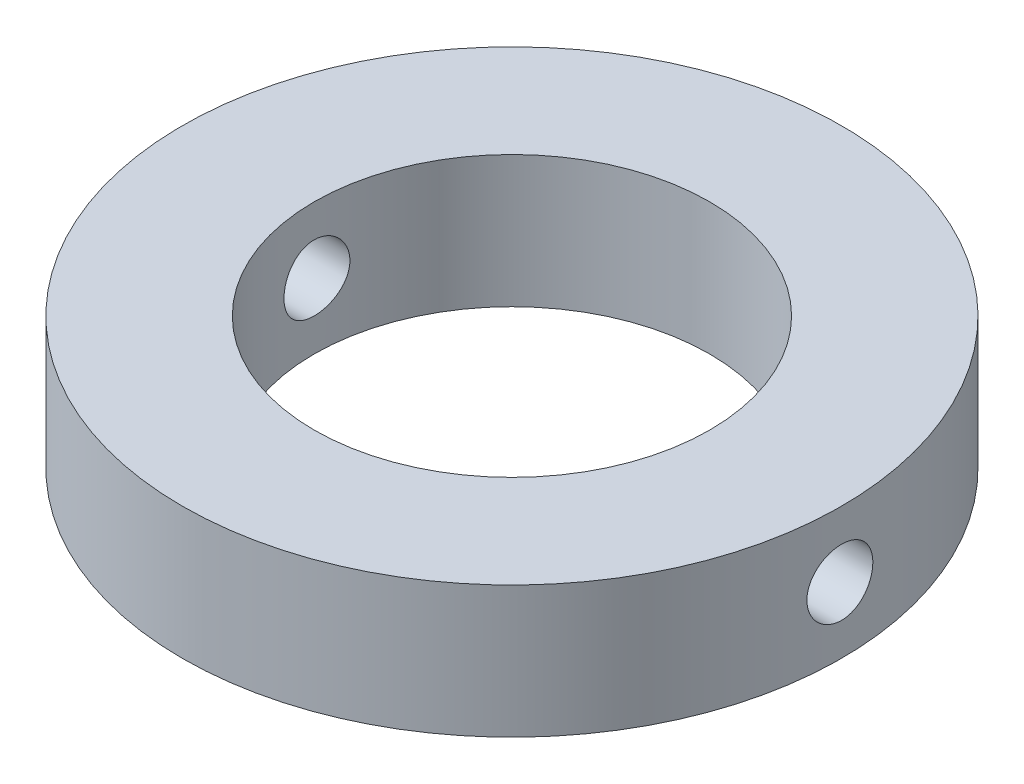
ISO-10303-21;
HEADER;
FILE_DESCRIPTION(('STEP AP214'),'2;1');
FILE_NAME('part.step','',(''),(''),'','','');
FILE_SCHEMA(('AUTOMOTIVE_DESIGN { 1 0 10303 214 1 1 1 1 }'));
ENDSEC;
DATA;
#1=APPLICATION_CONTEXT('core data for automotive mechanical design processes');
#2=APPLICATION_PROTOCOL_DEFINITION('international standard','automotive_design',2000,#1);
#3=PRODUCT_CONTEXT('',#1,'mechanical');
#4=PRODUCT('Part','Part','',(#3));
#5=PRODUCT_RELATED_PRODUCT_CATEGORY('part','',(#4));
#6=PRODUCT_DEFINITION_FORMATION('','',#4);
#7=PRODUCT_DEFINITION_CONTEXT('part definition',#1,'design');
#8=PRODUCT_DEFINITION('design','',#6,#7);
#9=PRODUCT_DEFINITION_SHAPE('','',#8);
#10=(LENGTH_UNIT() NAMED_UNIT(*) SI_UNIT(.MILLI.,.METRE.));
#11=(NAMED_UNIT(*) PLANE_ANGLE_UNIT() SI_UNIT($,.RADIAN.));
#12=(NAMED_UNIT(*) SI_UNIT($,.STERADIAN.) SOLID_ANGLE_UNIT());
#13=UNCERTAINTY_MEASURE_WITH_UNIT(LENGTH_MEASURE(1.E-05),#10,'distance_accuracy_value','');
#14=(GEOMETRIC_REPRESENTATION_CONTEXT(3) GLOBAL_UNCERTAINTY_ASSIGNED_CONTEXT((#13)) GLOBAL_UNIT_ASSIGNED_CONTEXT((#10,
#11,#12)) REPRESENTATION_CONTEXT('',''));
#15=CARTESIAN_POINT('',(0.,0.,0.));
#16=DIRECTION('',(0.,0.,1.));
#17=DIRECTION('',(1.,0.,0.));
#18=AXIS2_PLACEMENT_3D('',#15,#16,#17);
#19=CARTESIAN_POINT('',(0.,10.,0.));
#20=DIRECTION('',(0.,1.,0.));
#21=DIRECTION('',(0.,0.,1.));
#22=AXIS2_PLACEMENT_3D('',#19,#20,#21);
#23=PLANE('',#22);
#24=CARTESIAN_POINT('',(0.,10.,0.));
#25=DIRECTION('',(0.,1.,0.));
#26=DIRECTION('',(0.,0.,1.));
#27=AXIS2_PLACEMENT_3D('',#24,#25,#26);
#28=CIRCLE('',#27,25.);
#29=CARTESIAN_POINT('',(0.,10.,25.));
#30=VERTEX_POINT('',#29);
#31=EDGE_CURVE('E10',#30,#30,#28,.T.);
#32=ORIENTED_EDGE('',*,*,#31,.T.);
#33=EDGE_LOOP('',(#32));
#34=FACE_BOUND('',#33,.T.);
#35=CARTESIAN_POINT('',(0.,10.,0.));
#36=DIRECTION('',(0.,1.,0.));
#37=DIRECTION('',(0.,0.,1.));
#38=AXIS2_PLACEMENT_3D('',#35,#36,#37);
#39=CIRCLE('',#38,15.);
#40=CARTESIAN_POINT('',(0.,10.,15.));
#41=VERTEX_POINT('',#40);
#42=EDGE_CURVE('E56',#41,#41,#39,.T.);
#43=ORIENTED_EDGE('',*,*,#42,.F.);
#44=EDGE_LOOP('',(#43));
#45=FACE_BOUND('',#44,.T.);
#46=ADVANCED_FACE('F37',(#34,#45),#23,.T.);
#47=CARTESIAN_POINT('',(0.,0.,0.));
#48=DIRECTION('',(0.,1.,0.));
#49=DIRECTION('',(0.,0.,1.));
#50=AXIS2_PLACEMENT_3D('',#47,#48,#49);
#51=PLANE('',#50);
#52=CARTESIAN_POINT('',(0.,0.,0.));
#53=DIRECTION('',(0.,1.,0.));
#54=DIRECTION('',(0.,0.,1.));
#55=AXIS2_PLACEMENT_3D('',#52,#53,#54);
#56=CIRCLE('',#55,25.);
#57=CARTESIAN_POINT('',(0.,0.,25.));
#58=VERTEX_POINT('',#57);
#59=EDGE_CURVE('E51',#58,#58,#56,.T.);
#60=ORIENTED_EDGE('',*,*,#59,.F.);
#61=EDGE_LOOP('',(#60));
#62=FACE_BOUND('',#61,.T.);
#63=CARTESIAN_POINT('',(0.,0.,0.));
#64=DIRECTION('',(0.,1.,0.));
#65=DIRECTION('',(0.,0.,1.));
#66=AXIS2_PLACEMENT_3D('',#63,#64,#65);
#67=CIRCLE('',#66,15.);
#68=CARTESIAN_POINT('',(0.,0.,15.));
#69=VERTEX_POINT('',#68);
#70=EDGE_CURVE('E59',#69,#69,#67,.T.);
#71=ORIENTED_EDGE('',*,*,#70,.T.);
#72=EDGE_LOOP('',(#71));
#73=FACE_BOUND('',#72,.T.);
#74=ADVANCED_FACE('F95',(#62,#73),#51,.F.);
#75=CARTESIAN_POINT('',(0.,10.,0.));
#76=DIRECTION('',(0.,-1.,0.));
#77=DIRECTION('',(0.,0.,-1.));
#78=AXIS2_PLACEMENT_3D('',#75,#76,#77);
#79=CYLINDRICAL_SURFACE('',#78,25.);
#80=CARTESIAN_POINT('',(-24.8746859276655,5.,-2.5));
#81=CARTESIAN_POINT('',(-24.8746875699226,5.14004891043401,-2.49999393348378));
#82=CARTESIAN_POINT('',(-24.8758814248555,5.2801904210296,-2.48819214745619));
#83=CARTESIAN_POINT('',(-24.880527188953,5.55658796573384,-2.4412907869089));
#84=CARTESIAN_POINT('',(-24.8839815865305,5.69283954509373,-2.40616553721609));
#85=CARTESIAN_POINT('',(-24.8927533261847,5.95741454804476,-2.31365029017232));
#86=CARTESIAN_POINT('',(-24.8980695386697,6.0857427234786,-2.25627379073475));
#87=CARTESIAN_POINT('',(-24.9099645142955,6.33091948072937,-2.12091066847775));
#88=CARTESIAN_POINT('',(-24.9165430266082,6.4477703362093,-2.04292813906481));
#89=CARTESIAN_POINT('',(-24.9302481677475,6.66712815914375,-1.86826190499676));
#90=CARTESIAN_POINT('',(-24.9373765001317,6.76958752375946,-1.77151854527065));
#91=CARTESIAN_POINT('',(-24.951362630893,6.95684402250892,-1.56220428829891));
#92=CARTESIAN_POINT('',(-24.9582204168803,7.04164034851578,-1.44963266726642));
#93=CARTESIAN_POINT('',(-24.9709095788901,7.19132814251788,-1.21156590412747));
#94=CARTESIAN_POINT('',(-24.9767387723662,7.25617749698416,-1.08604415632392));
#95=CARTESIAN_POINT('',(-24.9866954218943,7.36386108287171,-0.825824960718776));
#96=CARTESIAN_POINT('',(-24.9908229194266,7.40669585092367,-0.691127736670547));
#97=CARTESIAN_POINT('',(-24.9968991642756,7.46899477338312,-0.416861956857374));
#98=CARTESIAN_POINT('',(-24.9988551960704,7.48853708187486,-0.277311317578953));
#99=CARTESIAN_POINT('',(-25.0003928899673,7.50393817283429,0.00310185172235791));
#100=CARTESIAN_POINT('',(-24.9999746136318,7.49979756936568,0.143964347636153));
#101=CARTESIAN_POINT('',(-24.9968167827796,7.46801381837461,0.422472110161401));
#102=CARTESIAN_POINT('',(-24.9940855287928,7.44045471109027,0.560127074837448));
#103=CARTESIAN_POINT('',(-24.9866182316233,7.36274717763345,0.828847948761333));
#104=CARTESIAN_POINT('',(-24.9818821623988,7.31259845803107,0.959913772394322));
#105=CARTESIAN_POINT('',(-24.9709234370979,7.1910430918639,1.21200078669897));
#106=CARTESIAN_POINT('',(-24.9646981841439,7.11959925617461,1.33300392745412));
#107=CARTESIAN_POINT('',(-24.9514596129852,6.95750869165908,1.56133378293548));
#108=CARTESIAN_POINT('',(-24.9444462716703,6.86686139963705,1.66866009640207));
#109=CARTESIAN_POINT('',(-24.9303823366963,6.66846442621588,1.86708192955672));
#110=CARTESIAN_POINT('',(-24.9233317143257,6.56064163814606,1.95810436547586));
#111=CARTESIAN_POINT('',(-24.9100184982056,6.33120783697306,2.12076883839479));
#112=CARTESIAN_POINT('',(-24.9037559055991,6.20959680386964,2.19241084728222));
#113=CARTESIAN_POINT('',(-24.8927272378537,5.95598243700052,2.31428046143308));
#114=CARTESIAN_POINT('',(-24.8879614783139,5.82397691894278,2.3645035514324));
#115=CARTESIAN_POINT('',(-24.8804725467734,5.55334848846328,2.44205183909397));
#116=CARTESIAN_POINT('',(-24.8777493125442,5.41472577778139,2.46937773435758));
#117=CARTESIAN_POINT('',(-24.8746645131854,5.13543955117623,2.5002619384799));
#118=CARTESIAN_POINT('',(-24.8742927886901,4.99478744933792,2.50392249161803));
#119=CARTESIAN_POINT('',(-24.8759262838693,4.71487183544284,2.48764061717841));
#120=CARTESIAN_POINT('',(-24.8779314714265,4.57560830464908,2.46769850852439));
#121=CARTESIAN_POINT('',(-24.88408361056,4.30272104430415,2.4048629362688));
#122=CARTESIAN_POINT('',(-24.8882260500336,4.16908607226335,2.36201781797227));
#123=CARTESIAN_POINT('',(-24.8981822759699,3.91089987067424,2.25464179918985));
#124=CARTESIAN_POINT('',(-24.9039961007167,3.78634884928204,2.19011040195897));
#125=CARTESIAN_POINT('',(-24.9166646088928,3.54940006492806,2.04093750355804));
#126=CARTESIAN_POINT('',(-24.9235227703668,3.43704514508436,1.95622824960173));
#127=CARTESIAN_POINT('',(-24.9374958156297,3.22811236681484,1.76920133362794));
#128=CARTESIAN_POINT('',(-24.9446107057716,3.13153489914981,1.66688323562034));
#129=CARTESIAN_POINT('',(-24.9583261962325,2.95654591650477,1.44709951056618));
#130=CARTESIAN_POINT('',(-24.9649248513869,2.87820110103445,1.32958063992363));
#131=CARTESIAN_POINT('',(-24.9768360526658,2.74236032873397,1.08299429354283));
#132=CARTESIAN_POINT('',(-24.9821486164123,2.68486408623224,0.953926976074064));
#133=CARTESIAN_POINT('',(-24.9908802603501,2.59246558086166,0.688140316082038));
#134=CARTESIAN_POINT('',(-24.9943027151412,2.55752303168697,0.551435094124898));
#135=CARTESIAN_POINT('',(-24.9988823653412,2.51109232605039,0.274062034959198));
#136=CARTESIAN_POINT('',(-25.0000396244141,2.4996035104149,0.133394309230544));
#137=CARTESIAN_POINT('',(-24.9999584578317,2.50041566609986,-0.147255560189367));
#138=CARTESIAN_POINT('',(-24.9987304594167,2.51261309209164,-0.28723801806132));
#139=CARTESIAN_POINT('',(-24.9940373394398,2.56023436414244,-0.563154720890907));
#140=CARTESIAN_POINT('',(-24.9905722161218,2.59565822843242,-0.699088962670915));
#141=CARTESIAN_POINT('',(-24.981793095349,2.68869814348233,-0.963049771919359));
#142=CARTESIAN_POINT('',(-24.9764793500812,2.74631116733539,-1.09107741519382));
#143=CARTESIAN_POINT('',(-24.9645953104074,2.88208292229245,-1.33566150038699));
#144=CARTESIAN_POINT('',(-24.9580250233539,2.9602415331778,-1.4522180094214));
#145=CARTESIAN_POINT('',(-24.9443296167264,3.13527404755938,-1.67108181106735));
#146=CARTESIAN_POINT('',(-24.9372022865175,3.232225040612,-1.77332731554835));
#147=CARTESIAN_POINT('',(-24.9232147692415,3.44193837886362,-1.96014439848286));
#148=CARTESIAN_POINT('',(-24.9163546466944,3.55470451292269,-2.04471172961962));
#149=CARTESIAN_POINT('',(-24.903659585265,3.79316085479978,-2.19394160106013));
#150=CARTESIAN_POINT('',(-24.8978272981327,3.91888320331014,-2.25855296998709));
#151=CARTESIAN_POINT('',(-24.8878798690615,4.17937072811559,-2.36566177024692));
#152=CARTESIAN_POINT('',(-24.883762791334,4.31412550981429,-2.40818414472465));
#153=CARTESIAN_POINT('',(-24.8787501884536,4.54136935224779,-2.45930422083382));
#154=CARTESIAN_POINT('',(-24.8772332983924,4.63240562826607,-2.47454428099556));
#155=CARTESIAN_POINT('',(-24.8752006294416,4.81561455760639,-2.49489414651278));
#156=CARTESIAN_POINT('',(-24.8746848463496,4.90778720615648,-2.50000399439316));
#157=CARTESIAN_POINT('',(-24.8746859276655,5.,-2.5));
#158=B_SPLINE_CURVE_WITH_KNOTS('',3,(#80,#81,#82,#83,#84,#85,#86,#87,#88,#89,#90,#91,#92,#93,
#94,#95,#96,#97,#98,#99,#100,#101,#102,#103,#104,#105,#106,#107,#108,#109,#110,#111,#112,#113,
#114,#115,#116,#117,#118,#119,#120,#121,#122,#123,#124,#125,#126,#127,#128,#129,#130,#131,#132,
#133,#134,#135,#136,#137,#138,#139,#140,#141,#142,#143,#144,#145,#146,#147,#148,#149,#150,#151,
#152,#153,#154,#155,#156,#157),.UNSPECIFIED.,.T.,.F.,(4,2,2,2,2,2,2,2,2,2,2,2,2,2,2,2,2,2,2,2,2,
2,2,2,2,2,2,2,2,2,2,2,2,2,2,2,2,2,4),(0.,0.419809986091155,0.840082879554424,1.26010122749369,
1.68003620105329,2.10132903824813,2.52264114638132,2.94483674928229,3.36702206019487,
3.78778677246124,4.20854057495581,4.62779079546654,5.04704646202436,5.46703863666034,
5.88704313046322,6.30888562712503,6.73072873568907,7.15266072794834,7.57457986487582,
7.99467490769413,8.41476427417176,8.83397036761318,9.25318606402618,9.67382974529295,
10.0944838430801,10.516653420453,10.9388172129501,11.360224817359,11.7816205778287,
12.2011783367121,12.6207364249165,13.0402372998812,13.45973572027,13.8809928759497,
14.3023511258631,14.7247810267619,15.14673287235,15.4231506901512,15.6995673475954),.UNSPECIFIED.);
#159=CARTESIAN_POINT('',(-24.8746859276655,5.,-2.5));
#160=VERTEX_POINT('',#159);
#161=EDGE_CURVE('E84',#160,#160,#158,.T.);
#162=ORIENTED_EDGE('',*,*,#161,.T.);
#163=EDGE_LOOP('',(#162));
#164=FACE_BOUND('',#163,.T.);
#165=CARTESIAN_POINT('',(24.8746859276655,5.,-2.5));
#166=CARTESIAN_POINT('',(24.8746875699226,4.85995108956599,-2.49999393348378));
#167=CARTESIAN_POINT('',(24.8758814248555,4.7198095789704,-2.48819214745619));
#168=CARTESIAN_POINT('',(24.880527188953,4.44341203426616,-2.44129078690891));
#169=CARTESIAN_POINT('',(24.8839815865305,4.30716045490627,-2.40616553721609));
#170=CARTESIAN_POINT('',(24.8927533261847,4.04258545195524,-2.31365029017232));
#171=CARTESIAN_POINT('',(24.8980695386697,3.9142572765214,-2.25627379073475));
#172=CARTESIAN_POINT('',(24.9099645142955,3.66908051927063,-2.12091066847775));
#173=CARTESIAN_POINT('',(24.9165430266082,3.5522296637907,-2.04292813906481));
#174=CARTESIAN_POINT('',(24.9302481677475,3.33287184085625,-1.86826190499676));
#175=CARTESIAN_POINT('',(24.9373765001317,3.23041247624054,-1.77151854527065));
#176=CARTESIAN_POINT('',(24.951362630893,3.04315597749108,-1.56220428829891));
#177=CARTESIAN_POINT('',(24.9582204168803,2.95835965148422,-1.44963266726642));
#178=CARTESIAN_POINT('',(24.9709095788901,2.80867185748212,-1.21156590412747));
#179=CARTESIAN_POINT('',(24.9767387723662,2.74382250301584,-1.08604415632392));
#180=CARTESIAN_POINT('',(24.9866954218943,2.63613891712829,-0.825824960718776));
#181=CARTESIAN_POINT('',(24.9908229194266,2.59330414907633,-0.691127736670547));
#182=CARTESIAN_POINT('',(24.9968991642756,2.53100522661688,-0.416861956857374));
#183=CARTESIAN_POINT('',(24.9988551960704,2.51146291812514,-0.277311317578954));
#184=CARTESIAN_POINT('',(25.0003928899673,2.49606182716571,0.00310185172235774));
#185=CARTESIAN_POINT('',(24.9999746136318,2.50020243063432,0.143964347636153));
#186=CARTESIAN_POINT('',(24.9968167827796,2.53198618162539,0.422472110161401));
#187=CARTESIAN_POINT('',(24.9940855287928,2.55954528890973,0.560127074837448));
#188=CARTESIAN_POINT('',(24.9866182316233,2.63725282236655,0.828847948761333));
#189=CARTESIAN_POINT('',(24.9818821623988,2.68740154196893,0.959913772394322));
#190=CARTESIAN_POINT('',(24.9709234370979,2.8089569081361,1.21200078669897));
#191=CARTESIAN_POINT('',(24.9646981841439,2.88040074382539,1.33300392745413));
#192=CARTESIAN_POINT('',(24.9514596129852,3.04249130834092,1.56133378293549));
#193=CARTESIAN_POINT('',(24.9444462716703,3.13313860036296,1.66866009640207));
#194=CARTESIAN_POINT('',(24.9303823366963,3.33153557378412,1.86708192955672));
#195=CARTESIAN_POINT('',(24.9233317143257,3.43935836185394,1.95810436547586));
#196=CARTESIAN_POINT('',(24.9100184982056,3.66879216302694,2.12076883839479));
#197=CARTESIAN_POINT('',(24.9037559055991,3.79040319613036,2.19241084728222));
#198=CARTESIAN_POINT('',(24.8927272378537,4.04401756299948,2.31428046143308));
#199=CARTESIAN_POINT('',(24.8879614783139,4.17602308105722,2.3645035514324));
#200=CARTESIAN_POINT('',(24.8804725467734,4.44665151153672,2.44205183909397));
#201=CARTESIAN_POINT('',(24.8777493125442,4.58527422221861,2.46937773435758));
#202=CARTESIAN_POINT('',(24.8746645131854,4.86456044882377,2.5002619384799));
#203=CARTESIAN_POINT('',(24.8742927886901,5.00521255066208,2.50392249161803));
#204=CARTESIAN_POINT('',(24.8759262838693,5.28512816455716,2.48764061717841));
#205=CARTESIAN_POINT('',(24.8779314714265,5.42439169535092,2.46769850852439));
#206=CARTESIAN_POINT('',(24.88408361056,5.69727895569585,2.4048629362688));
#207=CARTESIAN_POINT('',(24.8882260500336,5.83091392773665,2.36201781797227));
#208=CARTESIAN_POINT('',(24.8981822759699,6.08910012932576,2.25464179918985));
#209=CARTESIAN_POINT('',(24.9039961007167,6.21365115071796,2.19011040195897));
#210=CARTESIAN_POINT('',(24.9166646088928,6.45059993507194,2.04093750355804));
#211=CARTESIAN_POINT('',(24.9235227703668,6.56295485491564,1.95622824960173));
#212=CARTESIAN_POINT('',(24.9374958156297,6.77188763318516,1.76920133362794));
#213=CARTESIAN_POINT('',(24.9446107057716,6.86846510085019,1.66688323562034));
#214=CARTESIAN_POINT('',(24.9583261962325,7.04345408349523,1.44709951056618));
#215=CARTESIAN_POINT('',(24.9649248513869,7.12179889896555,1.32958063992363));
#216=CARTESIAN_POINT('',(24.9768360526658,7.25763967126603,1.08299429354283));
#217=CARTESIAN_POINT('',(24.9821486164123,7.31513591376776,0.953926976074063));
#218=CARTESIAN_POINT('',(24.9908802603501,7.40753441913834,0.688140316082037));
#219=CARTESIAN_POINT('',(24.9943027151412,7.44247696831304,0.551435094124898));
#220=CARTESIAN_POINT('',(24.9988823653412,7.48890767394961,0.274062034959197));
#221=CARTESIAN_POINT('',(25.0000396244141,7.5003964895851,0.133394309230543));
#222=CARTESIAN_POINT('',(24.9999584578317,7.49958433390014,-0.147255560189367));
#223=CARTESIAN_POINT('',(24.9987304594167,7.48738690790836,-0.28723801806132));
#224=CARTESIAN_POINT('',(24.9940373394398,7.43976563585756,-0.563154720890907));
#225=CARTESIAN_POINT('',(24.9905722161218,7.40434177156758,-0.699088962670914));
#226=CARTESIAN_POINT('',(24.981793095349,7.31130185651767,-0.96304977191936));
#227=CARTESIAN_POINT('',(24.9764793500812,7.25368883266461,-1.09107741519382));
#228=CARTESIAN_POINT('',(24.9645953104074,7.11791707770755,-1.33566150038699));
#229=CARTESIAN_POINT('',(24.9580250233539,7.0397584668222,-1.4522180094214));
#230=CARTESIAN_POINT('',(24.9443296167264,6.86472595244062,-1.67108181106735));
#231=CARTESIAN_POINT('',(24.9372022865175,6.767774959388,-1.77332731554835));
#232=CARTESIAN_POINT('',(24.9232147692415,6.55806162113638,-1.96014439848286));
#233=CARTESIAN_POINT('',(24.9163546466944,6.44529548707731,-2.04471172961962));
#234=CARTESIAN_POINT('',(24.903659585265,6.20683914520022,-2.19394160106013));
#235=CARTESIAN_POINT('',(24.8978272981327,6.08111679668987,-2.25855296998709));
#236=CARTESIAN_POINT('',(24.8878798690615,5.82062927188442,-2.36566177024692));
#237=CARTESIAN_POINT('',(24.883762791334,5.68587449018571,-2.40818414472465));
#238=CARTESIAN_POINT('',(24.8787501884536,5.45863064775221,-2.45930422083382));
#239=CARTESIAN_POINT('',(24.8772332983924,5.36759437173393,-2.47454428099556));
#240=CARTESIAN_POINT('',(24.8752006294416,5.18438544239361,-2.49489414651278));
#241=CARTESIAN_POINT('',(24.8746848463496,5.09221279384352,-2.50000399439316));
#242=CARTESIAN_POINT('',(24.8746859276655,5.,-2.5));
#243=B_SPLINE_CURVE_WITH_KNOTS('',3,(#165,#166,#167,#168,#169,#170,#171,#172,#173,#174,#175,
#176,#177,#178,#179,#180,#181,#182,#183,#184,#185,#186,#187,#188,#189,#190,#191,#192,#193,#194,
#195,#196,#197,#198,#199,#200,#201,#202,#203,#204,#205,#206,#207,#208,#209,#210,#211,#212,#213,
#214,#215,#216,#217,#218,#219,#220,#221,#222,#223,#224,#225,#226,#227,#228,#229,#230,#231,#232,
#233,#234,#235,#236,#237,#238,#239,#240,#241,#242),.UNSPECIFIED.,.T.,.F.,(4,2,2,2,2,2,2,2,2,2,2,
2,2,2,2,2,2,2,2,2,2,2,2,2,2,2,2,2,2,2,2,2,2,2,2,2,2,2,4),(0.,0.419809986091155,
0.840082879554424,1.26010122749369,1.68003620105329,2.10132903824813,2.52264114638132,
2.94483674928229,3.36702206019487,3.78778677246124,4.20854057495581,4.62779079546654,
5.04704646202436,5.46703863666034,5.88704313046322,6.30888562712503,6.73072873568907,
7.15266072794834,7.57457986487582,7.99467490769413,8.41476427417176,8.83397036761318,
9.25318606402618,9.67382974529295,10.0944838430801,10.516653420453,10.9388172129501,
11.360224817359,11.7816205778287,12.2011783367121,12.6207364249165,13.0402372998812,
13.45973572027,13.8809928759497,14.3023511258631,14.7247810267619,15.14673287235,
15.4231506901512,15.6995673475954),.UNSPECIFIED.);
#244=CARTESIAN_POINT('',(24.8746859276655,5.,-2.5));
#245=VERTEX_POINT('',#244);
#246=EDGE_CURVE('E79',#245,#245,#243,.T.);
#247=ORIENTED_EDGE('',*,*,#246,.T.);
#248=EDGE_LOOP('',(#247));
#249=FACE_BOUND('',#248,.T.);
#250=ORIENTED_EDGE('',*,*,#31,.F.);
#251=EDGE_LOOP('',(#250));
#252=FACE_BOUND('',#251,.T.);
#253=ORIENTED_EDGE('',*,*,#59,.T.);
#254=EDGE_LOOP('',(#253));
#255=FACE_BOUND('',#254,.T.);
#256=ADVANCED_FACE('F39',(#164,#249,#252,#255),#79,.T.);
#257=CARTESIAN_POINT('',(0.,10.,0.));
#258=DIRECTION('',(0.,-1.,0.));
#259=DIRECTION('',(0.,0.,-1.));
#260=AXIS2_PLACEMENT_3D('',#257,#258,#259);
#261=CYLINDRICAL_SURFACE('',#260,15.);
#262=CARTESIAN_POINT('',(-14.790199457749,5.,-2.5));
#263=CARTESIAN_POINT('',(-14.790201973666,5.13937574816181,-2.49999439841983));
#264=CARTESIAN_POINT('',(-14.7921909238523,5.27882760607147,-2.48830516902828));
#265=CARTESIAN_POINT('',(-14.7999245720004,5.55381854326317,-2.44187742806638));
#266=CARTESIAN_POINT('',(-14.8056727334637,5.68935389375807,-2.40711766030861));
#267=CARTESIAN_POINT('',(-14.8202560936731,5.95249228334161,-2.31562954367049));
#268=CARTESIAN_POINT('',(-14.8290887118401,6.08010184866225,-2.25891955493199));
#269=CARTESIAN_POINT('',(-14.8488427210228,6.32398095471778,-2.12518649688947));
#270=CARTESIAN_POINT('',(-14.8597638769423,6.44025176957733,-2.04816571350133));
#271=CARTESIAN_POINT('',(-14.8825847115588,6.65931284974457,-1.87518752696654));
#272=CARTESIAN_POINT('',(-14.8944921732795,6.76197513138622,-1.77906904893234));
#273=CARTESIAN_POINT('',(-14.9178748066858,6.94979330686181,-1.57097200469527));
#274=CARTESIAN_POINT('',(-14.9293499527174,7.03494816311542,-1.45899249914997));
#275=CARTESIAN_POINT('',(-14.9506573698271,7.18581456721928,-1.22152286994836));
#276=CARTESIAN_POINT('',(-14.9604794243234,7.2514070077318,-1.09595608145671));
#277=CARTESIAN_POINT('',(-14.9772873695709,7.36052107053055,-0.835395621723868));
#278=CARTESIAN_POINT('',(-14.9842734447266,7.40404412788488,-0.700402564078187));
#279=CARTESIAN_POINT('',(-14.994567347244,7.4673925349839,-0.426143726344241));
#280=CARTESIAN_POINT('',(-14.9979085311091,7.48743291600469,-0.286928886679269));
#281=CARTESIAN_POINT('',(-15.0006507934278,7.5039157541526,-0.00707528552579566));
#282=CARTESIAN_POINT('',(-15.0000521396931,7.50035981524723,0.1335633785289));
#283=CARTESIAN_POINT('',(-14.9950085843139,7.46991864847179,0.410802185078877));
#284=CARTESIAN_POINT('',(-14.990601836924,7.44326483659085,0.547428530700142));
#285=CARTESIAN_POINT('',(-14.9784797877164,7.36774892575351,0.814241979611793));
#286=CARTESIAN_POINT('',(-14.9707643851321,7.3188861504105,0.944428886651505));
#287=CARTESIAN_POINT('',(-14.9528269851196,7.20010935968468,1.19535614778265));
#288=CARTESIAN_POINT('',(-14.9425936732688,7.13009998791756,1.31605052301905));
#289=CARTESIAN_POINT('',(-14.920757380715,6.97108717736495,1.54406552984664));
#290=CARTESIAN_POINT('',(-14.9091542891913,6.88208220128918,1.65138507791588));
#291=CARTESIAN_POINT('',(-14.885702682326,6.68632119338069,1.85097127344667));
#292=CARTESIAN_POINT('',(-14.8738528973104,6.57936290509902,1.94303950225321));
#293=CARTESIAN_POINT('',(-14.8513795978481,6.35141290978418,2.10795458844807));
#294=CARTESIAN_POINT('',(-14.8407560947132,6.23042107331718,2.18080126853242));
#295=CARTESIAN_POINT('',(-14.8219375456182,5.97760835812252,2.30524443448829));
#296=CARTESIAN_POINT('',(-14.813745233026,5.84577550190791,2.35681702727924));
#297=CARTESIAN_POINT('',(-14.8007618868988,5.57515092769246,2.43702987081562));
#298=CARTESIAN_POINT('',(-14.7959705538832,5.43635982356758,2.46567214076796));
#299=CARTESIAN_POINT('',(-14.7903895942212,5.15753384383787,2.49893188487927));
#300=CARTESIAN_POINT('',(-14.7895528575867,5.0175336202979,2.50383220791244));
#301=CARTESIAN_POINT('',(-14.7918503478236,4.73871332830918,2.49022270268246));
#302=CARTESIAN_POINT('',(-14.7949844213185,4.59989321448603,2.47171377862467));
#303=CARTESIAN_POINT('',(-14.8048268745502,4.32827224080914,2.4120523349281));
#304=CARTESIAN_POINT('',(-14.8115125191835,4.19543886012199,2.37104379064639));
#305=CARTESIAN_POINT('',(-14.827685730055,3.93852983372051,2.26769819019228));
#306=CARTESIAN_POINT('',(-14.8371734639058,3.8144547124491,2.20535985810094));
#307=CARTESIAN_POINT('',(-14.8579912839739,3.57732540559389,2.06045667322923));
#308=CARTESIAN_POINT('',(-14.8693375560035,3.46438342724394,1.97771056415936));
#309=CARTESIAN_POINT('',(-14.8925466667987,3.253886467305,1.79458946570798));
#310=CARTESIAN_POINT('',(-14.9044095418533,3.15633256889026,1.69421323638404));
#311=CARTESIAN_POINT('',(-14.9274642211826,2.9783481072713,1.47742807032881));
#312=CARTESIAN_POINT('',(-14.9386477634467,2.89810617371546,1.3608632533862));
#313=CARTESIAN_POINT('',(-14.9589511243294,2.75834467299512,1.11574344794933));
#314=CARTESIAN_POINT('',(-14.9680710096998,2.69882443552615,0.987188847470626));
#315=CARTESIAN_POINT('',(-14.9831835816958,2.60248941604513,0.722299051501327));
#316=CARTESIAN_POINT('',(-14.9891898456762,2.56557592426508,0.58600056260261));
#317=CARTESIAN_POINT('',(-14.9974558316928,2.51518440103617,0.30903073487421));
#318=CARTESIAN_POINT('',(-14.9997158620019,2.50170444126765,0.168359756821619));
#319=CARTESIAN_POINT('',(-15.0002303788781,2.4986181176878,-0.111541275773677));
#320=CARTESIAN_POINT('',(-14.9985330202419,2.50872474605892,-0.250768160602666));
#321=CARTESIAN_POINT('',(-14.9914217838733,2.55190392226943,-0.525511974314706));
#322=CARTESIAN_POINT('',(-14.9860079269518,2.58497634150967,-0.66102892396748));
#323=CARTESIAN_POINT('',(-14.972069888274,2.67303816554365,-0.924396445918538));
#324=CARTESIAN_POINT('',(-14.9635491704088,2.72800316821005,-1.05225537215382));
#325=CARTESIAN_POINT('',(-14.9443275687803,2.85825793623058,-1.29698045298217));
#326=CARTESIAN_POINT('',(-14.9336265816741,2.93354866506245,-1.41384608611822));
#327=CARTESIAN_POINT('',(-14.9110762961641,3.1033350924605,-1.6347129455264));
#328=CARTESIAN_POINT('',(-14.8992152454112,3.19804095475126,-1.73855143060275));
#329=CARTESIAN_POINT('',(-14.8757630331437,3.40352830790381,-1.92896387595091));
#330=CARTESIAN_POINT('',(-14.8641719354951,3.51431355891253,-2.0155337867119));
#331=CARTESIAN_POINT('',(-14.8424834353391,3.74974532248962,-2.16951427091086));
#332=CARTESIAN_POINT('',(-14.8323971784578,3.87448433976549,-2.2367849890577));
#333=CARTESIAN_POINT('',(-14.8149921009131,4.13360923583815,-2.34931453640427));
#334=CARTESIAN_POINT('',(-14.8076705172488,4.26798532267737,-2.39459535522307));
#335=CARTESIAN_POINT('',(-14.7982474485649,4.50240376948738,-2.45202605312742));
#336=CARTESIAN_POINT('',(-14.7952462341947,4.60102680796261,-2.46998741767139));
#337=CARTESIAN_POINT('',(-14.7912213528807,4.79975348483694,-2.49397629518131));
#338=CARTESIAN_POINT('',(-14.7901976500369,4.8998570963242,-2.50000402479277));
#339=CARTESIAN_POINT('',(-14.790199457749,5.,-2.5));
#340=B_SPLINE_CURVE_WITH_KNOTS('',3,(#262,#263,#264,#265,#266,#267,#268,#269,#270,#271,#272,
#273,#274,#275,#276,#277,#278,#279,#280,#281,#282,#283,#284,#285,#286,#287,#288,#289,#290,#291,
#292,#293,#294,#295,#296,#297,#298,#299,#300,#301,#302,#303,#304,#305,#306,#307,#308,#309,#310,
#311,#312,#313,#314,#315,#316,#317,#318,#319,#320,#321,#322,#323,#324,#325,#326,#327,#328,#329,
#330,#331,#332,#333,#334,#335,#336,#337,#338,#339),.UNSPECIFIED.,.T.,.F.,(4,2,2,2,2,2,2,2,2,2,2,
2,2,2,2,2,2,2,2,2,2,2,2,2,2,2,2,2,2,2,2,2,2,2,2,2,2,2,4),(0.,0.417761038927741,0.83590751996297,
1.25370499787519,1.67145547405274,2.09289159155715,2.51435267834447,2.93832980111435,
3.36227935111113,3.78231567472566,4.20232344652692,4.61817121164669,5.03403164249533,
5.45179604139426,5.86959426226765,6.29246123462124,6.71533210746019,7.13867662498604,
7.56198385938077,7.98023542420411,8.39847083413976,8.81406064635492,9.22967532293575,
9.64912342762702,10.0686010443069,10.4924411303538,10.916267504767,11.3382298441765,
11.7601574591235,12.1769777626592,12.5937957321882,13.0101503983246,13.4265248039234,
13.8476699746325,14.2689137888181,14.6931372761832,15.1169356674445,15.4171067054377,
15.7172722940182),.UNSPECIFIED.);
#341=CARTESIAN_POINT('',(-14.790199457749,5.,-2.5));
#342=VERTEX_POINT('',#341);
#343=EDGE_CURVE('E42',#342,#342,#340,.T.);
#344=ORIENTED_EDGE('',*,*,#343,.F.);
#345=EDGE_LOOP('',(#344));
#346=FACE_BOUND('',#345,.T.);
#347=CARTESIAN_POINT('',(14.790199457749,5.,-2.5));
#348=CARTESIAN_POINT('',(14.790201973666,4.86062425183819,-2.49999439841983));
#349=CARTESIAN_POINT('',(14.7921909238523,4.72117239392853,-2.48830516902828));
#350=CARTESIAN_POINT('',(14.7999245720004,4.44618145673683,-2.44187742806638));
#351=CARTESIAN_POINT('',(14.8056727334637,4.31064610624193,-2.40711766030861));
#352=CARTESIAN_POINT('',(14.8202560936731,4.04750771665839,-2.31562954367049));
#353=CARTESIAN_POINT('',(14.8290887118401,3.91989815133775,-2.25891955493199));
#354=CARTESIAN_POINT('',(14.8488427210228,3.67601904528222,-2.12518649688947));
#355=CARTESIAN_POINT('',(14.8597638769423,3.55974823042267,-2.04816571350133));
#356=CARTESIAN_POINT('',(14.8825847115588,3.34068715025544,-1.87518752696654));
#357=CARTESIAN_POINT('',(14.8944921732795,3.23802486861378,-1.77906904893234));
#358=CARTESIAN_POINT('',(14.9178748066858,3.05020669313819,-1.57097200469527));
#359=CARTESIAN_POINT('',(14.9293499527174,2.96505183688458,-1.45899249914997));
#360=CARTESIAN_POINT('',(14.9506573698271,2.81418543278072,-1.22152286994836));
#361=CARTESIAN_POINT('',(14.9604794243234,2.7485929922682,-1.09595608145671));
#362=CARTESIAN_POINT('',(14.9772873695709,2.63947892946945,-0.835395621723867));
#363=CARTESIAN_POINT('',(14.9842734447266,2.59595587211512,-0.700402564078187));
#364=CARTESIAN_POINT('',(14.994567347244,2.5326074650161,-0.426143726344241));
#365=CARTESIAN_POINT('',(14.9979085311091,2.51256708399531,-0.28692888667927));
#366=CARTESIAN_POINT('',(15.0006507934278,2.4960842458474,-0.00707528552579596));
#367=CARTESIAN_POINT('',(15.0000521396931,2.49964018475277,0.1335633785289));
#368=CARTESIAN_POINT('',(14.9950085843139,2.53008135152821,0.410802185078877));
#369=CARTESIAN_POINT('',(14.990601836924,2.55673516340915,0.547428530700142));
#370=CARTESIAN_POINT('',(14.9784797877164,2.63225107424649,0.814241979611793));
#371=CARTESIAN_POINT('',(14.9707643851321,2.6811138495895,0.944428886651505));
#372=CARTESIAN_POINT('',(14.9528269851196,2.79989064031532,1.19535614778265));
#373=CARTESIAN_POINT('',(14.9425936732688,2.86990001208244,1.31605052301905));
#374=CARTESIAN_POINT('',(14.920757380715,3.02891282263505,1.54406552984664));
#375=CARTESIAN_POINT('',(14.9091542891913,3.11791779871082,1.65138507791588));
#376=CARTESIAN_POINT('',(14.885702682326,3.31367880661931,1.85097127344667));
#377=CARTESIAN_POINT('',(14.8738528973104,3.42063709490098,1.94303950225321));
#378=CARTESIAN_POINT('',(14.8513795978481,3.64858709021582,2.10795458844807));
#379=CARTESIAN_POINT('',(14.8407560947132,3.76957892668282,2.18080126853242));
#380=CARTESIAN_POINT('',(14.8219375456182,4.02239164187748,2.30524443448829));
#381=CARTESIAN_POINT('',(14.813745233026,4.15422449809209,2.35681702727924));
#382=CARTESIAN_POINT('',(14.8007618868988,4.42484907230754,2.43702987081562));
#383=CARTESIAN_POINT('',(14.7959705538832,4.56364017643242,2.46567214076796));
#384=CARTESIAN_POINT('',(14.7903895942212,4.84246615616213,2.49893188487927));
#385=CARTESIAN_POINT('',(14.7895528575867,4.9824663797021,2.50383220791244));
#386=CARTESIAN_POINT('',(14.7918503478236,5.26128667169082,2.49022270268246));
#387=CARTESIAN_POINT('',(14.7949844213185,5.40010678551397,2.47171377862467));
#388=CARTESIAN_POINT('',(14.8048268745502,5.67172775919086,2.4120523349281));
#389=CARTESIAN_POINT('',(14.8115125191835,5.80456113987801,2.37104379064639));
#390=CARTESIAN_POINT('',(14.827685730055,6.06147016627949,2.26769819019228));
#391=CARTESIAN_POINT('',(14.8371734639058,6.1855452875509,2.20535985810094));
#392=CARTESIAN_POINT('',(14.8579912839739,6.42267459440611,2.06045667322923));
#393=CARTESIAN_POINT('',(14.8693375560035,6.53561657275606,1.97771056415936));
#394=CARTESIAN_POINT('',(14.8925466667987,6.746113532695,1.79458946570798));
#395=CARTESIAN_POINT('',(14.9044095418533,6.84366743110974,1.69421323638404));
#396=CARTESIAN_POINT('',(14.9274642211826,7.0216518927287,1.47742807032881));
#397=CARTESIAN_POINT('',(14.9386477634467,7.10189382628454,1.3608632533862));
#398=CARTESIAN_POINT('',(14.9589511243294,7.24165532700488,1.11574344794933));
#399=CARTESIAN_POINT('',(14.9680710096998,7.30117556447385,0.987188847470626));
#400=CARTESIAN_POINT('',(14.9831835816958,7.39751058395487,0.722299051501328));
#401=CARTESIAN_POINT('',(14.9891898456762,7.43442407573492,0.586000562602612));
#402=CARTESIAN_POINT('',(14.9974558316928,7.48481559896383,0.309030734874211));
#403=CARTESIAN_POINT('',(14.9997158620019,7.49829555873235,0.16835975682162));
#404=CARTESIAN_POINT('',(15.0002303788781,7.5013818823122,-0.111541275773677));
#405=CARTESIAN_POINT('',(14.9985330202419,7.49127525394108,-0.250768160602665));
#406=CARTESIAN_POINT('',(14.9914217838733,7.44809607773057,-0.525511974314705));
#407=CARTESIAN_POINT('',(14.9860079269518,7.41502365849033,-0.66102892396748));
#408=CARTESIAN_POINT('',(14.972069888274,7.32696183445635,-0.924396445918539));
#409=CARTESIAN_POINT('',(14.9635491704088,7.27199683178995,-1.05225537215382));
#410=CARTESIAN_POINT('',(14.9443275687803,7.14174206376942,-1.29698045298217));
#411=CARTESIAN_POINT('',(14.9336265816741,7.06645133493755,-1.41384608611822));
#412=CARTESIAN_POINT('',(14.9110762961641,6.8966649075395,-1.6347129455264));
#413=CARTESIAN_POINT('',(14.8992152454112,6.80195904524874,-1.73855143060275));
#414=CARTESIAN_POINT('',(14.8757630331437,6.59647169209619,-1.92896387595091));
#415=CARTESIAN_POINT('',(14.8641719354951,6.48568644108747,-2.0155337867119));
#416=CARTESIAN_POINT('',(14.8424834353391,6.25025467751038,-2.16951427091086));
#417=CARTESIAN_POINT('',(14.8323971784578,6.12551566023451,-2.2367849890577));
#418=CARTESIAN_POINT('',(14.8149921009131,5.86639076416185,-2.34931453640427));
#419=CARTESIAN_POINT('',(14.8076705172488,5.73201467732263,-2.39459535522307));
#420=CARTESIAN_POINT('',(14.7982474485649,5.49759623051262,-2.45202605312742));
#421=CARTESIAN_POINT('',(14.7952462341947,5.39897319203739,-2.46998741767139));
#422=CARTESIAN_POINT('',(14.7912213528807,5.20024651516306,-2.49397629518131));
#423=CARTESIAN_POINT('',(14.7901976500369,5.1001429036758,-2.50000402479277));
#424=CARTESIAN_POINT('',(14.790199457749,5.,-2.5));
#425=B_SPLINE_CURVE_WITH_KNOTS('',3,(#347,#348,#349,#350,#351,#352,#353,#354,#355,#356,#357,
#358,#359,#360,#361,#362,#363,#364,#365,#366,#367,#368,#369,#370,#371,#372,#373,#374,#375,#376,
#377,#378,#379,#380,#381,#382,#383,#384,#385,#386,#387,#388,#389,#390,#391,#392,#393,#394,#395,
#396,#397,#398,#399,#400,#401,#402,#403,#404,#405,#406,#407,#408,#409,#410,#411,#412,#413,#414,
#415,#416,#417,#418,#419,#420,#421,#422,#423,#424),.UNSPECIFIED.,.T.,.F.,(4,2,2,2,2,2,2,2,2,2,2,
2,2,2,2,2,2,2,2,2,2,2,2,2,2,2,2,2,2,2,2,2,2,2,2,2,2,2,4),(0.,0.41776103892774,0.83590751996297,
1.25370499787519,1.67145547405274,2.09289159155715,2.51435267834447,2.93832980111435,
3.36227935111113,3.78231567472565,4.20232344652692,4.61817121164669,5.03403164249533,
5.45179604139426,5.86959426226765,6.29246123462124,6.71533210746019,7.13867662498604,
7.56198385938078,7.98023542420411,8.39847083413977,8.81406064635492,9.22967532293575,
9.64912342762702,10.0686010443069,10.4924411303538,10.916267504767,11.3382298441765,
11.7601574591235,12.1769777626592,12.5937957321882,13.0101503983246,13.4265248039234,
13.8476699746325,14.2689137888181,14.6931372761832,15.1169356674445,15.4171067054377,
15.7172722940182),.UNSPECIFIED.);
#426=CARTESIAN_POINT('',(14.790199457749,5.,-2.5));
#427=VERTEX_POINT('',#426);
#428=EDGE_CURVE('E61',#427,#427,#425,.T.);
#429=ORIENTED_EDGE('',*,*,#428,.F.);
#430=EDGE_LOOP('',(#429));
#431=FACE_BOUND('',#430,.T.);
#432=ORIENTED_EDGE('',*,*,#42,.T.);
#433=EDGE_LOOP('',(#432));
#434=FACE_BOUND('',#433,.T.);
#435=ORIENTED_EDGE('',*,*,#70,.F.);
#436=EDGE_LOOP('',(#435));
#437=FACE_BOUND('',#436,.T.);
#438=ADVANCED_FACE('F66',(#346,#431,#434,#437),#261,.F.);
#439=CARTESIAN_POINT('',(-30.,5.,0.));
#440=DIRECTION('',(1.,0.,0.));
#441=DIRECTION('',(0.,0.,-1.));
#442=AXIS2_PLACEMENT_3D('',#439,#440,#441);
#443=CYLINDRICAL_SURFACE('',#442,2.5);
#444=ORIENTED_EDGE('',*,*,#428,.T.);
#445=EDGE_LOOP('',(#444));
#446=FACE_BOUND('',#445,.T.);
#447=ORIENTED_EDGE('',*,*,#246,.F.);
#448=EDGE_LOOP('',(#447));
#449=FACE_BOUND('',#448,.T.);
#450=ADVANCED_FACE('F72',(#446,#449),#443,.F.);
#451=ORIENTED_EDGE('',*,*,#343,.T.);
#452=EDGE_LOOP('',(#451));
#453=FACE_BOUND('',#452,.T.);
#454=ORIENTED_EDGE('',*,*,#161,.F.);
#455=EDGE_LOOP('',(#454));
#456=FACE_BOUND('',#455,.T.);
#457=ADVANCED_FACE('F69',(#453,#456),#443,.F.);
#458=CLOSED_SHELL('',(#46,#74,#256,#438,#450,#457));
#459=MANIFOLD_SOLID_BREP('B2',#458);
#460=ADVANCED_BREP_SHAPE_REPRESENTATION('',(#18,#459),#14);
#461=SHAPE_DEFINITION_REPRESENTATION(#9,#460);
ENDSEC;
END-ISO-10303-21;
